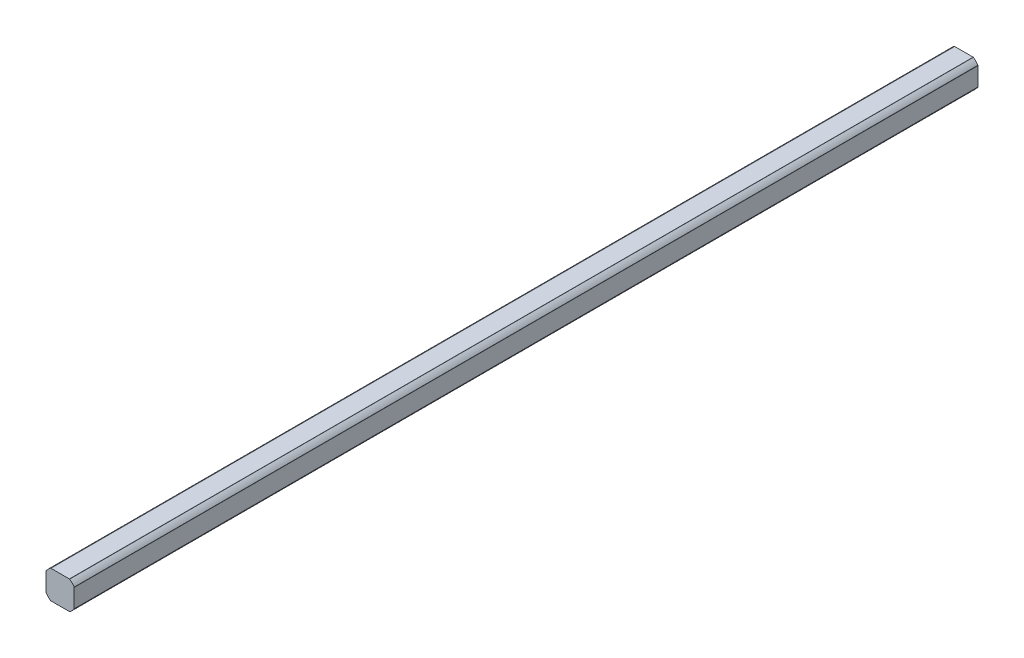
ISO-10303-21;
HEADER;
FILE_DESCRIPTION(('STEP AP214'),'2;1');
FILE_NAME('part.step','',(''),(''),'','','');
FILE_SCHEMA(('AUTOMOTIVE_DESIGN { 1 0 10303 214 1 1 1 1 }'));
ENDSEC;
DATA;
#1=APPLICATION_CONTEXT('core data for automotive mechanical design processes');
#2=APPLICATION_PROTOCOL_DEFINITION('international standard','automotive_design',2000,#1);
#3=PRODUCT_CONTEXT('',#1,'mechanical');
#4=PRODUCT('Part','Part','',(#3));
#5=PRODUCT_RELATED_PRODUCT_CATEGORY('part','',(#4));
#6=PRODUCT_DEFINITION_FORMATION('','',#4);
#7=PRODUCT_DEFINITION_CONTEXT('part definition',#1,'design');
#8=PRODUCT_DEFINITION('design','',#6,#7);
#9=PRODUCT_DEFINITION_SHAPE('','',#8);
#10=(LENGTH_UNIT() NAMED_UNIT(*) SI_UNIT(.MILLI.,.METRE.));
#11=(NAMED_UNIT(*) PLANE_ANGLE_UNIT() SI_UNIT($,.RADIAN.));
#12=(NAMED_UNIT(*) SI_UNIT($,.STERADIAN.) SOLID_ANGLE_UNIT());
#13=UNCERTAINTY_MEASURE_WITH_UNIT(LENGTH_MEASURE(1.E-05),#10,'distance_accuracy_value','');
#14=(GEOMETRIC_REPRESENTATION_CONTEXT(3) GLOBAL_UNCERTAINTY_ASSIGNED_CONTEXT((#13)) GLOBAL_UNIT_ASSIGNED_CONTEXT((#10,
#11,#12)) REPRESENTATION_CONTEXT('',''));
#15=CARTESIAN_POINT('',(0.,0.,0.));
#16=DIRECTION('',(0.,0.,1.));
#17=DIRECTION('',(1.,0.,0.));
#18=AXIS2_PLACEMENT_3D('',#15,#16,#17);
#19=CARTESIAN_POINT('',(0.,0.,304.8));
#20=DIRECTION('',(0.,0.,-1.));
#21=DIRECTION('',(-1.,0.,0.));
#22=AXIS2_PLACEMENT_3D('',#19,#20,#21);
#23=CYLINDRICAL_SURFACE('',#22,3.81);
#24=DIRECTION('',(0.,0.,1.));
#25=VECTOR('',#24,1.);
#26=CARTESIAN_POINT('',(3.15310344827586,-2.13870022314275,304.8));
#27=LINE('',#26,#25);
#28=CARTESIAN_POINT('',(3.15310344827586,-2.13870022314276,50.8));
#29=VERTEX_POINT('',#28);
#30=CARTESIAN_POINT('',(3.15310344827586,-2.13870022314276,254.));
#31=VERTEX_POINT('',#30);
#32=EDGE_CURVE('E205',#29,#31,#27,.T.);
#33=ORIENTED_EDGE('',*,*,#32,.T.);
#34=CARTESIAN_POINT('',(0.,0.,254.));
#35=DIRECTION('',(0.,0.,1.));
#36=DIRECTION('',(1.,0.,0.));
#37=AXIS2_PLACEMENT_3D('',#34,#35,#36);
#38=CIRCLE('',#37,3.81);
#39=CARTESIAN_POINT('',(2.13870022314276,-3.15310344827586,254.));
#40=VERTEX_POINT('',#39);
#41=EDGE_CURVE('E180',#40,#31,#38,.T.);
#42=ORIENTED_EDGE('',*,*,#41,.F.);
#43=DIRECTION('',(0.,0.,-1.));
#44=VECTOR('',#43,1.);
#45=CARTESIAN_POINT('',(2.13870022314275,-3.15310344827586,304.8));
#46=LINE('',#45,#44);
#47=CARTESIAN_POINT('',(2.13870022314275,-3.15310344827586,50.8));
#48=VERTEX_POINT('',#47);
#49=EDGE_CURVE('E67',#40,#48,#46,.T.);
#50=ORIENTED_EDGE('',*,*,#49,.T.);
#51=CARTESIAN_POINT('',(0.,0.,50.8));
#52=DIRECTION('',(0.,0.,1.));
#53=DIRECTION('',(1.,0.,0.));
#54=AXIS2_PLACEMENT_3D('',#51,#52,#53);
#55=CIRCLE('',#54,3.81);
#56=EDGE_CURVE('E276',#48,#29,#55,.T.);
#57=ORIENTED_EDGE('',*,*,#56,.T.);
#58=EDGE_LOOP('',(#33,#42,#50,#57));
#59=FACE_BOUND('',#58,.T.);
#60=ADVANCED_FACE('F42',(#59),#23,.T.);
#61=CARTESIAN_POINT('',(3.175,2.10605674187568,304.8));
#62=DIRECTION('',(-1.,0.,0.));
#63=DIRECTION('',(0.,0.,1.));
#64=AXIS2_PLACEMENT_3D('',#61,#62,#63);
#65=PLANE('',#64);
#66=DIRECTION('',(0.,1.,0.));
#67=VECTOR('',#66,1.);
#68=CARTESIAN_POINT('',(3.175,2.10605674187568,254.));
#69=LINE('',#68,#67);
#70=CARTESIAN_POINT('',(3.175,-2.06741021570466,254.));
#71=VERTEX_POINT('',#70);
#72=CARTESIAN_POINT('',(3.175,2.06741021570466,254.));
#73=VERTEX_POINT('',#72);
#74=EDGE_CURVE('E163',#71,#73,#69,.T.);
#75=ORIENTED_EDGE('',*,*,#74,.F.);
#76=DIRECTION('',(0.,0.,-1.));
#77=VECTOR('',#76,1.);
#78=CARTESIAN_POINT('',(3.175,-2.06741021570466,304.8));
#79=LINE('',#78,#77);
#80=CARTESIAN_POINT('',(3.175,-2.06741021570466,50.8));
#81=VERTEX_POINT('',#80);
#82=EDGE_CURVE('E185',#71,#81,#79,.T.);
#83=ORIENTED_EDGE('',*,*,#82,.T.);
#84=DIRECTION('',(0.,1.,0.));
#85=VECTOR('',#84,1.);
#86=CARTESIAN_POINT('',(3.175,2.10605674187568,50.8));
#87=LINE('',#86,#85);
#88=CARTESIAN_POINT('',(3.175,2.06741021570466,50.8));
#89=VERTEX_POINT('',#88);
#90=EDGE_CURVE('E287',#81,#89,#87,.T.);
#91=ORIENTED_EDGE('',*,*,#90,.T.);
#92=DIRECTION('',(0.,0.,1.));
#93=VECTOR('',#92,1.);
#94=CARTESIAN_POINT('',(3.175,2.06741021570466,304.8));
#95=LINE('',#94,#93);
#96=EDGE_CURVE('E184',#89,#73,#95,.T.);
#97=ORIENTED_EDGE('',*,*,#96,.T.);
#98=EDGE_LOOP('',(#75,#83,#91,#97));
#99=FACE_BOUND('',#98,.T.);
#100=ADVANCED_FACE('F304',(#99),#65,.F.);
#101=CARTESIAN_POINT('',(0.,0.,304.8));
#102=DIRECTION('',(0.,0.,-1.));
#103=DIRECTION('',(-1.,0.,0.));
#104=AXIS2_PLACEMENT_3D('',#101,#102,#103);
#105=CYLINDRICAL_SURFACE('',#104,3.81);
#106=DIRECTION('',(0.,0.,1.));
#107=VECTOR('',#106,1.);
#108=CARTESIAN_POINT('',(2.13870022314275,3.15310344827586,304.8));
#109=LINE('',#108,#107);
#110=CARTESIAN_POINT('',(2.13870022314276,3.15310344827586,50.8));
#111=VERTEX_POINT('',#110);
#112=CARTESIAN_POINT('',(2.13870022314276,3.15310344827586,254.));
#113=VERTEX_POINT('',#112);
#114=EDGE_CURVE('E177',#111,#113,#109,.T.);
#115=ORIENTED_EDGE('',*,*,#114,.T.);
#116=CARTESIAN_POINT('',(3.15310344827586,2.13870022314276,254.));
#117=VERTEX_POINT('',#116);
#118=EDGE_CURVE('E160',#117,#113,#38,.T.);
#119=ORIENTED_EDGE('',*,*,#118,.F.);
#120=DIRECTION('',(0.,0.,-1.));
#121=VECTOR('',#120,1.);
#122=CARTESIAN_POINT('',(3.15310344827586,2.13870022314275,304.8));
#123=LINE('',#122,#121);
#124=CARTESIAN_POINT('',(3.15310344827586,2.13870022314276,50.8));
#125=VERTEX_POINT('',#124);
#126=EDGE_CURVE('E174',#117,#125,#123,.T.);
#127=ORIENTED_EDGE('',*,*,#126,.T.);
#128=EDGE_CURVE('E277',#125,#111,#55,.T.);
#129=ORIENTED_EDGE('',*,*,#128,.T.);
#130=EDGE_LOOP('',(#115,#119,#127,#129));
#131=FACE_BOUND('',#130,.T.);
#132=ADVANCED_FACE('F172',(#131),#105,.T.);
#133=CARTESIAN_POINT('',(-2.10605674187568,3.175,304.8));
#134=DIRECTION('',(0.,-1.,0.));
#135=DIRECTION('',(0.,0.,-1.));
#136=AXIS2_PLACEMENT_3D('',#133,#134,#135);
#137=PLANE('',#136);
#138=DIRECTION('',(-1.,0.,0.));
#139=VECTOR('',#138,1.);
#140=CARTESIAN_POINT('',(-2.10605674187568,3.175,254.));
#141=LINE('',#140,#139);
#142=CARTESIAN_POINT('',(2.06741021570467,3.175,254.));
#143=VERTEX_POINT('',#142);
#144=CARTESIAN_POINT('',(-2.06741021570466,3.175,254.));
#145=VERTEX_POINT('',#144);
#146=EDGE_CURVE('E272',#143,#145,#141,.T.);
#147=ORIENTED_EDGE('',*,*,#146,.F.);
#148=DIRECTION('',(0.,0.,-1.));
#149=VECTOR('',#148,1.);
#150=CARTESIAN_POINT('',(2.06741021570466,3.175,304.8));
#151=LINE('',#150,#149);
#152=CARTESIAN_POINT('',(2.06741021570467,3.175,50.8));
#153=VERTEX_POINT('',#152);
#154=EDGE_CURVE('E46',#143,#153,#151,.T.);
#155=ORIENTED_EDGE('',*,*,#154,.T.);
#156=DIRECTION('',(-1.,0.,0.));
#157=VECTOR('',#156,1.);
#158=CARTESIAN_POINT('',(-2.10605674187568,3.175,50.8));
#159=LINE('',#158,#157);
#160=CARTESIAN_POINT('',(-2.06741021570466,3.175,50.8));
#161=VERTEX_POINT('',#160);
#162=EDGE_CURVE('E297',#153,#161,#159,.T.);
#163=ORIENTED_EDGE('',*,*,#162,.T.);
#164=DIRECTION('',(0.,0.,1.));
#165=VECTOR('',#164,1.);
#166=CARTESIAN_POINT('',(-2.06741021570466,3.175,304.8));
#167=LINE('',#166,#165);
#168=EDGE_CURVE('E201',#161,#145,#167,.T.);
#169=ORIENTED_EDGE('',*,*,#168,.T.);
#170=EDGE_LOOP('',(#147,#155,#163,#169));
#171=FACE_BOUND('',#170,.T.);
#172=ADVANCED_FACE('F389',(#171),#137,.F.);
#173=CARTESIAN_POINT('',(0.,0.,304.8));
#174=DIRECTION('',(0.,0.,-1.));
#175=DIRECTION('',(-1.,0.,0.));
#176=AXIS2_PLACEMENT_3D('',#173,#174,#175);
#177=CYLINDRICAL_SURFACE('',#176,3.81);
#178=DIRECTION('',(0.,0.,1.));
#179=VECTOR('',#178,1.);
#180=CARTESIAN_POINT('',(-3.15310344827586,2.13870022314275,304.8));
#181=LINE('',#180,#179);
#182=CARTESIAN_POINT('',(-3.15310344827586,2.13870022314276,50.8));
#183=VERTEX_POINT('',#182);
#184=CARTESIAN_POINT('',(-3.15310344827586,2.13870022314276,254.));
#185=VERTEX_POINT('',#184);
#186=EDGE_CURVE('E241',#183,#185,#181,.T.);
#187=ORIENTED_EDGE('',*,*,#186,.T.);
#188=CARTESIAN_POINT('',(-2.13870022314276,3.15310344827586,254.));
#189=VERTEX_POINT('',#188);
#190=EDGE_CURVE('E178',#189,#185,#38,.T.);
#191=ORIENTED_EDGE('',*,*,#190,.F.);
#192=DIRECTION('',(0.,0.,-1.));
#193=VECTOR('',#192,1.);
#194=CARTESIAN_POINT('',(-2.13870022314275,3.15310344827586,304.8));
#195=LINE('',#194,#193);
#196=CARTESIAN_POINT('',(-2.13870022314276,3.15310344827586,50.8));
#197=VERTEX_POINT('',#196);
#198=EDGE_CURVE('E190',#189,#197,#195,.T.);
#199=ORIENTED_EDGE('',*,*,#198,.T.);
#200=EDGE_CURVE('E280',#197,#183,#55,.T.);
#201=ORIENTED_EDGE('',*,*,#200,.T.);
#202=EDGE_LOOP('',(#187,#191,#199,#201));
#203=FACE_BOUND('',#202,.T.);
#204=ADVANCED_FACE('F323',(#203),#177,.T.);
#205=CARTESIAN_POINT('',(-3.175,2.10605674187568,304.8));
#206=DIRECTION('',(1.,0.,0.));
#207=DIRECTION('',(0.,1.,0.));
#208=AXIS2_PLACEMENT_3D('',#205,#206,#207);
#209=PLANE('',#208);
#210=DIRECTION('',(0.,-1.,0.));
#211=VECTOR('',#210,1.);
#212=CARTESIAN_POINT('',(-3.175,2.10605674187568,254.));
#213=LINE('',#212,#211);
#214=CARTESIAN_POINT('',(-3.175,2.06741021570466,254.));
#215=VERTEX_POINT('',#214);
#216=CARTESIAN_POINT('',(-3.175,-2.06741021570466,254.));
#217=VERTEX_POINT('',#216);
#218=EDGE_CURVE('E253',#215,#217,#213,.T.);
#219=ORIENTED_EDGE('',*,*,#218,.F.);
#220=DIRECTION('',(0.,0.,-1.));
#221=VECTOR('',#220,1.);
#222=CARTESIAN_POINT('',(-3.175,2.06741021570466,304.8));
#223=LINE('',#222,#221);
#224=CARTESIAN_POINT('',(-3.175,2.06741021570466,50.8));
#225=VERTEX_POINT('',#224);
#226=EDGE_CURVE('E240',#215,#225,#223,.T.);
#227=ORIENTED_EDGE('',*,*,#226,.T.);
#228=DIRECTION('',(0.,-1.,0.));
#229=VECTOR('',#228,1.);
#230=CARTESIAN_POINT('',(-3.175,2.10605674187568,50.8));
#231=LINE('',#230,#229);
#232=CARTESIAN_POINT('',(-3.175,-2.06741021570466,50.8));
#233=VERTEX_POINT('',#232);
#234=EDGE_CURVE('E254',#225,#233,#231,.T.);
#235=ORIENTED_EDGE('',*,*,#234,.T.);
#236=DIRECTION('',(0.,0.,1.));
#237=VECTOR('',#236,1.);
#238=CARTESIAN_POINT('',(-3.175,-2.06741021570466,304.8));
#239=LINE('',#238,#237);
#240=EDGE_CURVE('E232',#233,#217,#239,.T.);
#241=ORIENTED_EDGE('',*,*,#240,.T.);
#242=EDGE_LOOP('',(#219,#227,#235,#241));
#243=FACE_BOUND('',#242,.T.);
#244=ADVANCED_FACE('F252',(#243),#209,.F.);
#245=CARTESIAN_POINT('',(0.,0.,304.8));
#246=DIRECTION('',(0.,0.,-1.));
#247=DIRECTION('',(-1.,0.,0.));
#248=AXIS2_PLACEMENT_3D('',#245,#246,#247);
#249=CYLINDRICAL_SURFACE('',#248,3.81);
#250=DIRECTION('',(0.,0.,1.));
#251=VECTOR('',#250,1.);
#252=CARTESIAN_POINT('',(-2.13870022314275,-3.15310344827586,304.8));
#253=LINE('',#252,#251);
#254=CARTESIAN_POINT('',(-2.13870022314276,-3.15310344827586,50.8));
#255=VERTEX_POINT('',#254);
#256=CARTESIAN_POINT('',(-2.13870022314276,-3.15310344827586,254.));
#257=VERTEX_POINT('',#256);
#258=EDGE_CURVE('E228',#255,#257,#253,.T.);
#259=ORIENTED_EDGE('',*,*,#258,.T.);
#260=CARTESIAN_POINT('',(-3.15310344827586,-2.13870022314276,254.));
#261=VERTEX_POINT('',#260);
#262=EDGE_CURVE('E330',#261,#257,#38,.T.);
#263=ORIENTED_EDGE('',*,*,#262,.F.);
#264=DIRECTION('',(0.,0.,-1.));
#265=VECTOR('',#264,1.);
#266=CARTESIAN_POINT('',(-3.15310344827586,-2.13870022314275,304.8));
#267=LINE('',#266,#265);
#268=CARTESIAN_POINT('',(-3.15310344827586,-2.13870022314276,50.8));
#269=VERTEX_POINT('',#268);
#270=EDGE_CURVE('E231',#261,#269,#267,.T.);
#271=ORIENTED_EDGE('',*,*,#270,.T.);
#272=EDGE_CURVE('E314',#269,#255,#55,.T.);
#273=ORIENTED_EDGE('',*,*,#272,.T.);
#274=EDGE_LOOP('',(#259,#263,#271,#273));
#275=FACE_BOUND('',#274,.T.);
#276=ADVANCED_FACE('F340',(#275),#249,.T.);
#277=CARTESIAN_POINT('',(-2.10605674187568,-3.175,304.8));
#278=DIRECTION('',(0.,1.,0.));
#279=DIRECTION('',(1.,0.,0.));
#280=AXIS2_PLACEMENT_3D('',#277,#278,#279);
#281=PLANE('',#280);
#282=DIRECTION('',(1.,0.,0.));
#283=VECTOR('',#282,1.);
#284=CARTESIAN_POINT('',(-2.10605674187568,-3.175,254.));
#285=LINE('',#284,#283);
#286=CARTESIAN_POINT('',(-2.06741021570466,-3.175,254.));
#287=VERTEX_POINT('',#286);
#288=CARTESIAN_POINT('',(2.06741021570466,-3.175,254.));
#289=VERTEX_POINT('',#288);
#290=EDGE_CURVE('E60',#287,#289,#285,.T.);
#291=ORIENTED_EDGE('',*,*,#290,.F.);
#292=DIRECTION('',(0.,0.,-1.));
#293=VECTOR('',#292,1.);
#294=CARTESIAN_POINT('',(-2.06741021570466,-3.175,304.8));
#295=LINE('',#294,#293);
#296=CARTESIAN_POINT('',(-2.06741021570466,-3.175,50.8));
#297=VERTEX_POINT('',#296);
#298=EDGE_CURVE('E221',#287,#297,#295,.T.);
#299=ORIENTED_EDGE('',*,*,#298,.T.);
#300=DIRECTION('',(1.,0.,0.));
#301=VECTOR('',#300,1.);
#302=CARTESIAN_POINT('',(-2.10605674187568,-3.175,50.8));
#303=LINE('',#302,#301);
#304=CARTESIAN_POINT('',(2.06741021570466,-3.175,50.8));
#305=VERTEX_POINT('',#304);
#306=EDGE_CURVE('E279',#297,#305,#303,.T.);
#307=ORIENTED_EDGE('',*,*,#306,.T.);
#308=DIRECTION('',(0.,0.,1.));
#309=VECTOR('',#308,1.);
#310=CARTESIAN_POINT('',(2.06741021570466,-3.175,304.8));
#311=LINE('',#310,#309);
#312=EDGE_CURVE('E217',#305,#289,#311,.T.);
#313=ORIENTED_EDGE('',*,*,#312,.T.);
#314=EDGE_LOOP('',(#291,#299,#307,#313));
#315=FACE_BOUND('',#314,.T.);
#316=ADVANCED_FACE('F344',(#315),#281,.F.);
#317=CARTESIAN_POINT('',(2.06741021570466,3.048,304.8));
#318=DIRECTION('',(0.,0.,-1.));
#319=DIRECTION('',(-1.,0.,0.));
#320=AXIS2_PLACEMENT_3D('',#317,#318,#319);
#321=CYLINDRICAL_SURFACE('',#320,0.127);
#322=ORIENTED_EDGE('',*,*,#154,.F.);
#323=CARTESIAN_POINT('',(2.06741021570466,3.048,254.));
#324=DIRECTION('',(0.,0.,1.));
#325=DIRECTION('',(1.,0.,0.));
#326=AXIS2_PLACEMENT_3D('',#323,#324,#325);
#327=CIRCLE('',#326,0.127);
#328=EDGE_CURVE('E274',#143,#113,#327,.F.);
#329=ORIENTED_EDGE('',*,*,#328,.T.);
#330=ORIENTED_EDGE('',*,*,#114,.F.);
#331=CARTESIAN_POINT('',(2.06741021570466,3.048,50.8));
#332=DIRECTION('',(0.,0.,1.));
#333=DIRECTION('',(1.,0.,0.));
#334=AXIS2_PLACEMENT_3D('',#331,#332,#333);
#335=CIRCLE('',#334,0.127);
#336=EDGE_CURVE('E222',#153,#111,#335,.F.);
#337=ORIENTED_EDGE('',*,*,#336,.F.);
#338=EDGE_LOOP('',(#322,#329,#330,#337));
#339=FACE_BOUND('',#338,.T.);
#340=ADVANCED_FACE('F364',(#339),#321,.T.);
#341=CARTESIAN_POINT('',(3.048,2.06741021570466,304.8));
#342=DIRECTION('',(0.,0.,-1.));
#343=DIRECTION('',(-1.,0.,0.));
#344=AXIS2_PLACEMENT_3D('',#341,#342,#343);
#345=CYLINDRICAL_SURFACE('',#344,0.127);
#346=ORIENTED_EDGE('',*,*,#126,.F.);
#347=CARTESIAN_POINT('',(3.048,2.06741021570466,254.));
#348=DIRECTION('',(0.,0.,1.));
#349=DIRECTION('',(1.,0.,0.));
#350=AXIS2_PLACEMENT_3D('',#347,#348,#349);
#351=CIRCLE('',#350,0.127);
#352=EDGE_CURVE('E157',#117,#73,#351,.F.);
#353=ORIENTED_EDGE('',*,*,#352,.T.);
#354=ORIENTED_EDGE('',*,*,#96,.F.);
#355=CARTESIAN_POINT('',(3.048,2.06741021570466,50.8));
#356=DIRECTION('',(0.,0.,1.));
#357=DIRECTION('',(1.,0.,0.));
#358=AXIS2_PLACEMENT_3D('',#355,#356,#357);
#359=CIRCLE('',#358,0.127);
#360=EDGE_CURVE('E183',#125,#89,#359,.F.);
#361=ORIENTED_EDGE('',*,*,#360,.F.);
#362=EDGE_LOOP('',(#346,#353,#354,#361));
#363=FACE_BOUND('',#362,.T.);
#364=ADVANCED_FACE('F182',(#363),#345,.T.);
#365=CARTESIAN_POINT('',(-2.06741021570466,3.048,304.8));
#366=DIRECTION('',(0.,0.,-1.));
#367=DIRECTION('',(-1.,0.,0.));
#368=AXIS2_PLACEMENT_3D('',#365,#366,#367);
#369=CYLINDRICAL_SURFACE('',#368,0.127);
#370=ORIENTED_EDGE('',*,*,#198,.F.);
#371=CARTESIAN_POINT('',(-2.06741021570466,3.048,254.));
#372=DIRECTION('',(0.,0.,1.));
#373=DIRECTION('',(1.,0.,0.));
#374=AXIS2_PLACEMENT_3D('',#371,#372,#373);
#375=CIRCLE('',#374,0.127);
#376=EDGE_CURVE('E269',#189,#145,#375,.F.);
#377=ORIENTED_EDGE('',*,*,#376,.T.);
#378=ORIENTED_EDGE('',*,*,#168,.F.);
#379=CARTESIAN_POINT('',(-2.06741021570466,3.048,50.8));
#380=DIRECTION('',(0.,0.,1.));
#381=DIRECTION('',(1.,0.,0.));
#382=AXIS2_PLACEMENT_3D('',#379,#380,#381);
#383=CIRCLE('',#382,0.127);
#384=EDGE_CURVE('E295',#197,#161,#383,.F.);
#385=ORIENTED_EDGE('',*,*,#384,.F.);
#386=EDGE_LOOP('',(#370,#377,#378,#385));
#387=FACE_BOUND('',#386,.T.);
#388=ADVANCED_FACE('F44',(#387),#369,.T.);
#389=CARTESIAN_POINT('',(-3.048,2.06741021570466,304.8));
#390=DIRECTION('',(0.,0.,-1.));
#391=DIRECTION('',(-1.,0.,0.));
#392=AXIS2_PLACEMENT_3D('',#389,#390,#391);
#393=CYLINDRICAL_SURFACE('',#392,0.127);
#394=ORIENTED_EDGE('',*,*,#226,.F.);
#395=CARTESIAN_POINT('',(-3.048,2.06741021570466,254.));
#396=DIRECTION('',(0.,0.,1.));
#397=DIRECTION('',(1.,0.,0.));
#398=AXIS2_PLACEMENT_3D('',#395,#396,#397);
#399=CIRCLE('',#398,0.127);
#400=EDGE_CURVE('E263',#215,#185,#399,.F.);
#401=ORIENTED_EDGE('',*,*,#400,.T.);
#402=ORIENTED_EDGE('',*,*,#186,.F.);
#403=CARTESIAN_POINT('',(-3.048,2.06741021570466,50.8));
#404=DIRECTION('',(0.,0.,1.));
#405=DIRECTION('',(1.,0.,0.));
#406=AXIS2_PLACEMENT_3D('',#403,#404,#405);
#407=CIRCLE('',#406,0.127);
#408=EDGE_CURVE('E293',#225,#183,#407,.F.);
#409=ORIENTED_EDGE('',*,*,#408,.F.);
#410=EDGE_LOOP('',(#394,#401,#402,#409));
#411=FACE_BOUND('',#410,.T.);
#412=ADVANCED_FACE('F329',(#411),#393,.T.);
#413=CARTESIAN_POINT('',(-3.048,-2.06741021570466,304.8));
#414=DIRECTION('',(0.,0.,-1.));
#415=DIRECTION('',(-1.,0.,0.));
#416=AXIS2_PLACEMENT_3D('',#413,#414,#415);
#417=CYLINDRICAL_SURFACE('',#416,0.127);
#418=ORIENTED_EDGE('',*,*,#270,.F.);
#419=CARTESIAN_POINT('',(-3.048,-2.06741021570466,254.));
#420=DIRECTION('',(0.,0.,1.));
#421=DIRECTION('',(1.,0.,0.));
#422=AXIS2_PLACEMENT_3D('',#419,#420,#421);
#423=CIRCLE('',#422,0.127);
#424=EDGE_CURVE('E168',#261,#217,#423,.F.);
#425=ORIENTED_EDGE('',*,*,#424,.T.);
#426=ORIENTED_EDGE('',*,*,#240,.F.);
#427=CARTESIAN_POINT('',(-3.048,-2.06741021570466,50.8));
#428=DIRECTION('',(0.,0.,1.));
#429=DIRECTION('',(1.,0.,0.));
#430=AXIS2_PLACEMENT_3D('',#427,#428,#429);
#431=CIRCLE('',#430,0.127);
#432=EDGE_CURVE('E260',#269,#233,#431,.F.);
#433=ORIENTED_EDGE('',*,*,#432,.F.);
#434=EDGE_LOOP('',(#418,#425,#426,#433));
#435=FACE_BOUND('',#434,.T.);
#436=ADVANCED_FACE('F259',(#435),#417,.T.);
#437=CARTESIAN_POINT('',(-2.06741021570466,-3.048,304.8));
#438=DIRECTION('',(0.,0.,-1.));
#439=DIRECTION('',(-1.,0.,0.));
#440=AXIS2_PLACEMENT_3D('',#437,#438,#439);
#441=CYLINDRICAL_SURFACE('',#440,0.127);
#442=ORIENTED_EDGE('',*,*,#298,.F.);
#443=CARTESIAN_POINT('',(-2.06741021570466,-3.048,254.));
#444=DIRECTION('',(0.,0.,1.));
#445=DIRECTION('',(1.,0.,0.));
#446=AXIS2_PLACEMENT_3D('',#443,#444,#445);
#447=CIRCLE('',#446,0.127);
#448=EDGE_CURVE('E333',#287,#257,#447,.F.);
#449=ORIENTED_EDGE('',*,*,#448,.T.);
#450=ORIENTED_EDGE('',*,*,#258,.F.);
#451=CARTESIAN_POINT('',(-2.06741021570466,-3.048,50.8));
#452=DIRECTION('',(0.,0.,1.));
#453=DIRECTION('',(1.,0.,0.));
#454=AXIS2_PLACEMENT_3D('',#451,#452,#453);
#455=CIRCLE('',#454,0.127);
#456=EDGE_CURVE('E283',#297,#255,#455,.F.);
#457=ORIENTED_EDGE('',*,*,#456,.F.);
#458=EDGE_LOOP('',(#442,#449,#450,#457));
#459=FACE_BOUND('',#458,.T.);
#460=ADVANCED_FACE('F338',(#459),#441,.T.);
#461=CARTESIAN_POINT('',(3.048,-2.06741021570466,304.8));
#462=DIRECTION('',(0.,0.,-1.));
#463=DIRECTION('',(-1.,0.,0.));
#464=AXIS2_PLACEMENT_3D('',#461,#462,#463);
#465=CYLINDRICAL_SURFACE('',#464,0.127);
#466=ORIENTED_EDGE('',*,*,#82,.F.);
#467=CARTESIAN_POINT('',(3.048,-2.06741021570466,254.));
#468=DIRECTION('',(0.,0.,1.));
#469=DIRECTION('',(1.,0.,0.));
#470=AXIS2_PLACEMENT_3D('',#467,#468,#469);
#471=CIRCLE('',#470,0.127);
#472=EDGE_CURVE('E312',#71,#31,#471,.F.);
#473=ORIENTED_EDGE('',*,*,#472,.T.);
#474=ORIENTED_EDGE('',*,*,#32,.F.);
#475=CARTESIAN_POINT('',(3.048,-2.06741021570466,50.8));
#476=DIRECTION('',(0.,0.,1.));
#477=DIRECTION('',(1.,0.,0.));
#478=AXIS2_PLACEMENT_3D('',#475,#476,#477);
#479=CIRCLE('',#478,0.127);
#480=EDGE_CURVE('E285',#81,#29,#479,.F.);
#481=ORIENTED_EDGE('',*,*,#480,.F.);
#482=EDGE_LOOP('',(#466,#473,#474,#481));
#483=FACE_BOUND('',#482,.T.);
#484=ADVANCED_FACE('F311',(#483),#465,.T.);
#485=CARTESIAN_POINT('',(2.06741021570466,-3.048,304.8));
#486=DIRECTION('',(0.,0.,-1.));
#487=DIRECTION('',(-1.,0.,0.));
#488=AXIS2_PLACEMENT_3D('',#485,#486,#487);
#489=CYLINDRICAL_SURFACE('',#488,0.127);
#490=ORIENTED_EDGE('',*,*,#49,.F.);
#491=CARTESIAN_POINT('',(2.06741021570466,-3.048,254.));
#492=DIRECTION('',(0.,0.,1.));
#493=DIRECTION('',(1.,0.,0.));
#494=AXIS2_PLACEMENT_3D('',#491,#492,#493);
#495=CIRCLE('',#494,0.127);
#496=EDGE_CURVE('E11',#40,#289,#495,.F.);
#497=ORIENTED_EDGE('',*,*,#496,.T.);
#498=ORIENTED_EDGE('',*,*,#312,.F.);
#499=CARTESIAN_POINT('',(2.06741021570466,-3.048,50.8));
#500=DIRECTION('',(0.,0.,1.));
#501=DIRECTION('',(1.,0.,0.));
#502=AXIS2_PLACEMENT_3D('',#499,#500,#501);
#503=CIRCLE('',#502,0.127);
#504=EDGE_CURVE('E52',#48,#305,#503,.F.);
#505=ORIENTED_EDGE('',*,*,#504,.F.);
#506=EDGE_LOOP('',(#490,#497,#498,#505));
#507=FACE_BOUND('',#506,.T.);
#508=ADVANCED_FACE('F346',(#507),#489,.T.);
#509=CARTESIAN_POINT('',(0.,0.,50.8));
#510=DIRECTION('',(0.,0.,1.));
#511=DIRECTION('',(1.,0.,0.));
#512=AXIS2_PLACEMENT_3D('',#509,#510,#511);
#513=PLANE('',#512);
#514=ORIENTED_EDGE('',*,*,#336,.T.);
#515=ORIENTED_EDGE('',*,*,#128,.F.);
#516=ORIENTED_EDGE('',*,*,#360,.T.);
#517=ORIENTED_EDGE('',*,*,#90,.F.);
#518=ORIENTED_EDGE('',*,*,#480,.T.);
#519=ORIENTED_EDGE('',*,*,#56,.F.);
#520=ORIENTED_EDGE('',*,*,#504,.T.);
#521=ORIENTED_EDGE('',*,*,#306,.F.);
#522=ORIENTED_EDGE('',*,*,#456,.T.);
#523=ORIENTED_EDGE('',*,*,#272,.F.);
#524=ORIENTED_EDGE('',*,*,#432,.T.);
#525=ORIENTED_EDGE('',*,*,#234,.F.);
#526=ORIENTED_EDGE('',*,*,#408,.T.);
#527=ORIENTED_EDGE('',*,*,#200,.F.);
#528=ORIENTED_EDGE('',*,*,#384,.T.);
#529=ORIENTED_EDGE('',*,*,#162,.F.);
#530=EDGE_LOOP('',(#514,#515,#516,#517,#518,#519,#520,#521,#522,#523,#524,#525,#526,#527,#528,#529));
#531=FACE_BOUND('',#530,.T.);
#532=ADVANCED_FACE('F309',(#531),#513,.F.);
#533=CARTESIAN_POINT('',(0.,0.,254.));
#534=DIRECTION('',(0.,0.,1.));
#535=DIRECTION('',(1.,0.,0.));
#536=AXIS2_PLACEMENT_3D('',#533,#534,#535);
#537=PLANE('',#536);
#538=ORIENTED_EDGE('',*,*,#146,.T.);
#539=ORIENTED_EDGE('',*,*,#376,.F.);
#540=ORIENTED_EDGE('',*,*,#190,.T.);
#541=ORIENTED_EDGE('',*,*,#400,.F.);
#542=ORIENTED_EDGE('',*,*,#218,.T.);
#543=ORIENTED_EDGE('',*,*,#424,.F.);
#544=ORIENTED_EDGE('',*,*,#262,.T.);
#545=ORIENTED_EDGE('',*,*,#448,.F.);
#546=ORIENTED_EDGE('',*,*,#290,.T.);
#547=ORIENTED_EDGE('',*,*,#496,.F.);
#548=ORIENTED_EDGE('',*,*,#41,.T.);
#549=ORIENTED_EDGE('',*,*,#472,.F.);
#550=ORIENTED_EDGE('',*,*,#74,.T.);
#551=ORIENTED_EDGE('',*,*,#352,.F.);
#552=ORIENTED_EDGE('',*,*,#118,.T.);
#553=ORIENTED_EDGE('',*,*,#328,.F.);
#554=EDGE_LOOP('',(#538,#539,#540,#541,#542,#543,#544,#545,#546,#547,#548,#549,#550,#551,#552,#553));
#555=FACE_BOUND('',#554,.T.);
#556=ADVANCED_FACE('F159',(#555),#537,.T.);
#557=CLOSED_SHELL('',(#60,#100,#132,#172,#204,#244,#276,#316,#340,#364,#388,#412,#436,#460,#484,
#508,#532,#556));
#558=MANIFOLD_SOLID_BREP('B2',#557);
#559=ADVANCED_BREP_SHAPE_REPRESENTATION('',(#18,#558),#14);
#560=SHAPE_DEFINITION_REPRESENTATION(#9,#559);
ENDSEC;
END-ISO-10303-21;
